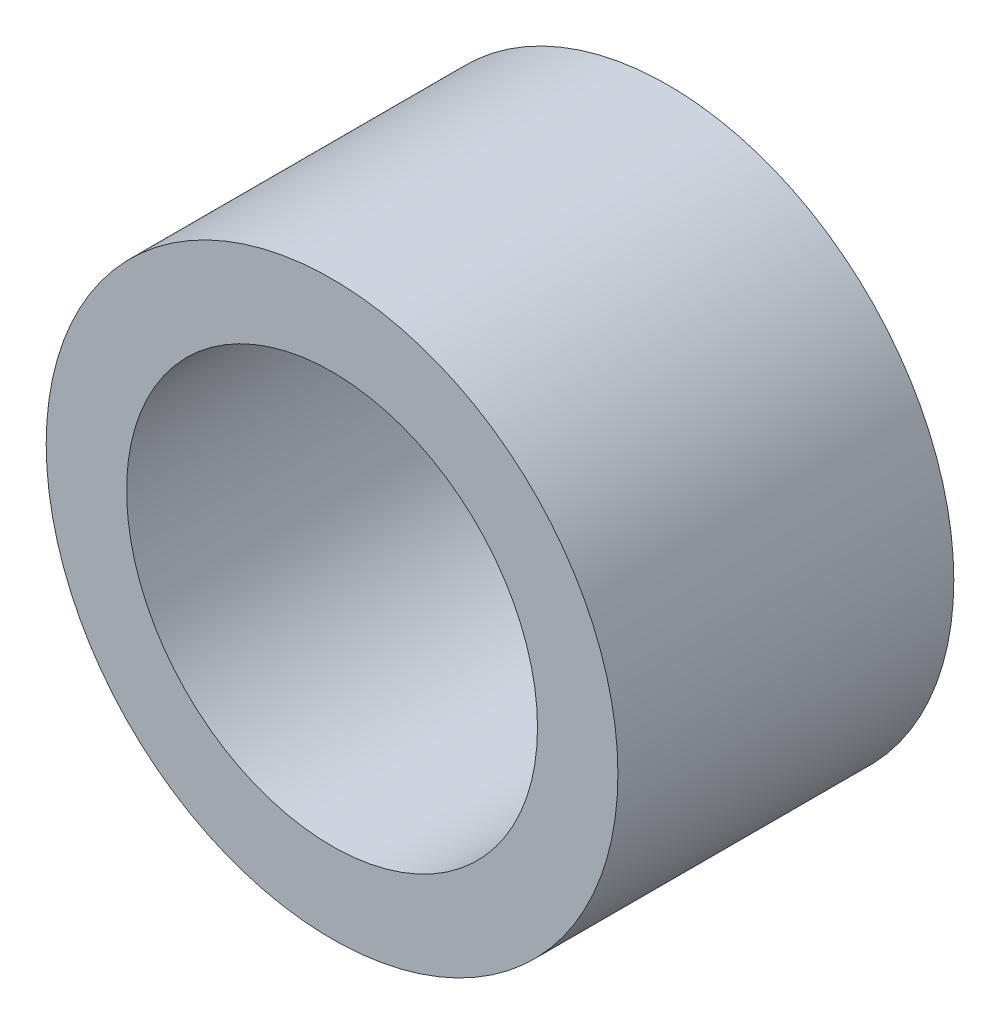
ISO-10303-21;
HEADER;
FILE_DESCRIPTION(('STEP AP214'),'2;1');
FILE_NAME('part.step','',(''),(''),'','','');
FILE_SCHEMA(('AUTOMOTIVE_DESIGN { 1 0 10303 214 1 1 1 1 }'));
ENDSEC;
DATA;
#1=APPLICATION_CONTEXT('core data for automotive mechanical design processes');
#2=APPLICATION_PROTOCOL_DEFINITION('international standard','automotive_design',2000,#1);
#3=PRODUCT_CONTEXT('',#1,'mechanical');
#4=PRODUCT('Part','Part','',(#3));
#5=PRODUCT_RELATED_PRODUCT_CATEGORY('part','',(#4));
#6=PRODUCT_DEFINITION_FORMATION('','',#4);
#7=PRODUCT_DEFINITION_CONTEXT('part definition',#1,'design');
#8=PRODUCT_DEFINITION('design','',#6,#7);
#9=PRODUCT_DEFINITION_SHAPE('','',#8);
#10=(LENGTH_UNIT() NAMED_UNIT(*) SI_UNIT(.MILLI.,.METRE.));
#11=(NAMED_UNIT(*) PLANE_ANGLE_UNIT() SI_UNIT($,.RADIAN.));
#12=(NAMED_UNIT(*) SI_UNIT($,.STERADIAN.) SOLID_ANGLE_UNIT());
#13=UNCERTAINTY_MEASURE_WITH_UNIT(LENGTH_MEASURE(1.E-05),#10,'distance_accuracy_value','');
#14=(GEOMETRIC_REPRESENTATION_CONTEXT(3) GLOBAL_UNCERTAINTY_ASSIGNED_CONTEXT((#13)) GLOBAL_UNIT_ASSIGNED_CONTEXT((#10,
#11,#12)) REPRESENTATION_CONTEXT('',''));
#15=CARTESIAN_POINT('',(0.,0.,0.));
#16=DIRECTION('',(0.,0.,1.));
#17=DIRECTION('',(1.,0.,0.));
#18=AXIS2_PLACEMENT_3D('',#15,#16,#17);
#19=CARTESIAN_POINT('',(0.,0.,-30.));
#20=DIRECTION('',(0.,0.,1.));
#21=DIRECTION('',(1.,0.,0.));
#22=AXIS2_PLACEMENT_3D('',#19,#20,#21);
#23=CYLINDRICAL_SURFACE('',#22,80.);
#24=CARTESIAN_POINT('',(0.,0.,-30.));
#25=DIRECTION('',(0.,0.,1.));
#26=DIRECTION('',(1.,0.,0.));
#27=AXIS2_PLACEMENT_3D('',#24,#25,#26);
#28=CIRCLE('',#27,80.);
#29=CARTESIAN_POINT('',(80.,0.,-30.));
#30=VERTEX_POINT('',#29);
#31=EDGE_CURVE('E10',#30,#30,#28,.T.);
#32=ORIENTED_EDGE('',*,*,#31,.T.);
#33=EDGE_LOOP('',(#32));
#34=FACE_BOUND('',#33,.T.);
#35=CARTESIAN_POINT('',(0.,0.,64.));
#36=DIRECTION('',(0.,0.,1.));
#37=DIRECTION('',(1.,0.,0.));
#38=AXIS2_PLACEMENT_3D('',#35,#36,#37);
#39=CIRCLE('',#38,80.);
#40=CARTESIAN_POINT('',(80.,0.,64.));
#41=VERTEX_POINT('',#40);
#42=EDGE_CURVE('E47',#41,#41,#39,.T.);
#43=ORIENTED_EDGE('',*,*,#42,.F.);
#44=EDGE_LOOP('',(#43));
#45=FACE_BOUND('',#44,.T.);
#46=ADVANCED_FACE('F37',(#34,#45),#23,.T.);
#47=CARTESIAN_POINT('',(0.,0.,-30.));
#48=DIRECTION('',(0.,0.,1.));
#49=DIRECTION('',(1.,0.,0.));
#50=AXIS2_PLACEMENT_3D('',#47,#48,#49);
#51=PLANE('',#50);
#52=CARTESIAN_POINT('',(0.,0.,-30.));
#53=DIRECTION('',(0.,0.,1.));
#54=DIRECTION('',(1.,0.,0.));
#55=AXIS2_PLACEMENT_3D('',#52,#53,#54);
#56=CIRCLE('',#55,57.5);
#57=CARTESIAN_POINT('',(57.5,0.,-30.));
#58=VERTEX_POINT('',#57);
#59=EDGE_CURVE('E43',#58,#58,#56,.T.);
#60=ORIENTED_EDGE('',*,*,#59,.T.);
#61=EDGE_LOOP('',(#60));
#62=FACE_BOUND('',#61,.T.);
#63=ORIENTED_EDGE('',*,*,#31,.F.);
#64=EDGE_LOOP('',(#63));
#65=FACE_BOUND('',#64,.T.);
#66=ADVANCED_FACE('F66',(#62,#65),#51,.F.);
#67=CARTESIAN_POINT('',(0.,0.,-30.));
#68=DIRECTION('',(0.,0.,1.));
#69=DIRECTION('',(1.,0.,0.));
#70=AXIS2_PLACEMENT_3D('',#67,#68,#69);
#71=CYLINDRICAL_SURFACE('',#70,57.5);
#72=ORIENTED_EDGE('',*,*,#59,.F.);
#73=EDGE_LOOP('',(#72));
#74=FACE_BOUND('',#73,.T.);
#75=CARTESIAN_POINT('',(0.,0.,64.));
#76=DIRECTION('',(0.,0.,1.));
#77=DIRECTION('',(1.,0.,0.));
#78=AXIS2_PLACEMENT_3D('',#75,#76,#77);
#79=CIRCLE('',#78,57.5);
#80=CARTESIAN_POINT('',(57.5,0.,64.));
#81=VERTEX_POINT('',#80);
#82=EDGE_CURVE('E51',#81,#81,#79,.T.);
#83=ORIENTED_EDGE('',*,*,#82,.T.);
#84=EDGE_LOOP('',(#83));
#85=FACE_BOUND('',#84,.T.);
#86=ADVANCED_FACE('F57',(#74,#85),#71,.F.);
#87=CARTESIAN_POINT('',(0.,0.,64.));
#88=DIRECTION('',(0.,0.,1.));
#89=DIRECTION('',(1.,0.,0.));
#90=AXIS2_PLACEMENT_3D('',#87,#88,#89);
#91=PLANE('',#90);
#92=ORIENTED_EDGE('',*,*,#42,.T.);
#93=EDGE_LOOP('',(#92));
#94=FACE_BOUND('',#93,.T.);
#95=ORIENTED_EDGE('',*,*,#82,.F.);
#96=EDGE_LOOP('',(#95));
#97=FACE_BOUND('',#96,.T.);
#98=ADVANCED_FACE('F59',(#94,#97),#91,.T.);
#99=CLOSED_SHELL('',(#46,#66,#86,#98));
#100=MANIFOLD_SOLID_BREP('B2',#99);
#101=ADVANCED_BREP_SHAPE_REPRESENTATION('',(#18,#100),#14);
#102=SHAPE_DEFINITION_REPRESENTATION(#9,#101);
ENDSEC;
END-ISO-10303-21;
